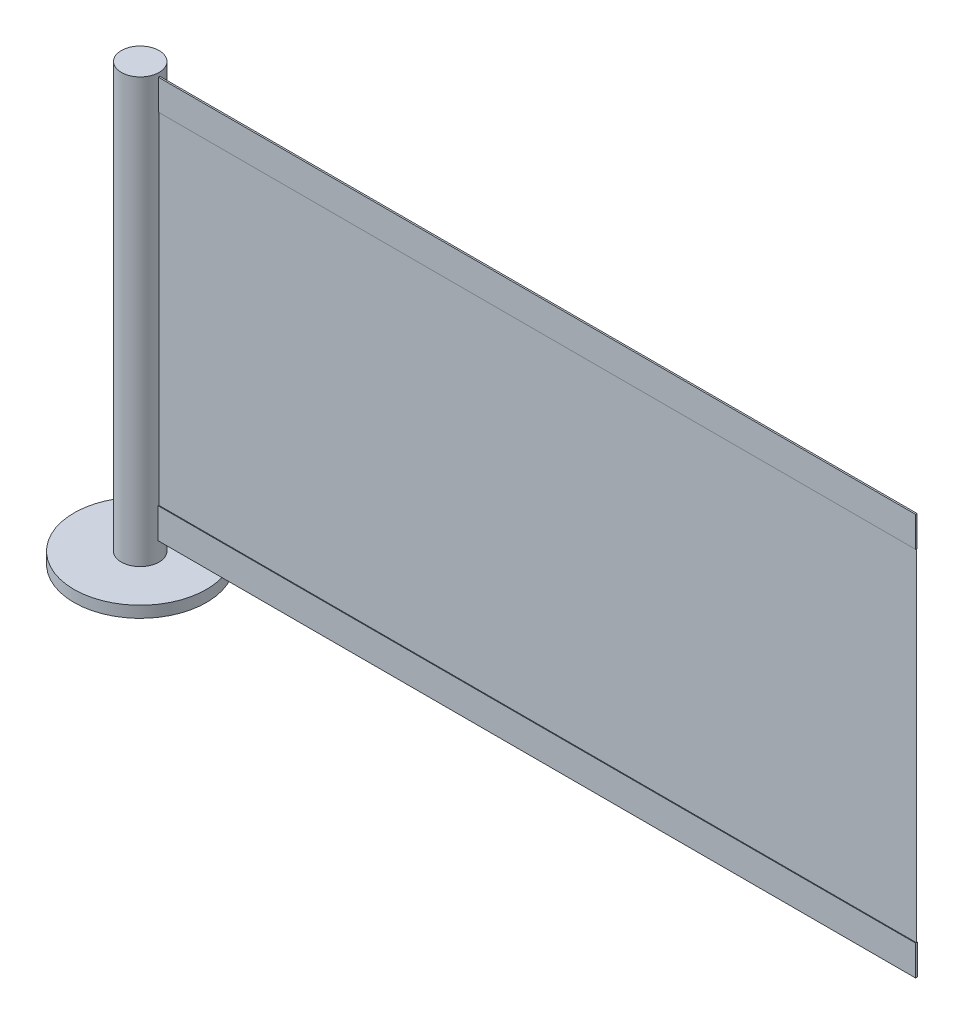
ISO-10303-21;
HEADER;
FILE_DESCRIPTION(('STEP AP214'),'2;1');
FILE_NAME('part.step','',(''),(''),'','','');
FILE_SCHEMA(('AUTOMOTIVE_DESIGN { 1 0 10303 214 1 1 1 1 }'));
ENDSEC;
DATA;
#1=APPLICATION_CONTEXT('core data for automotive mechanical design processes');
#2=APPLICATION_PROTOCOL_DEFINITION('international standard','automotive_design',2000,#1);
#3=PRODUCT_CONTEXT('',#1,'mechanical');
#4=PRODUCT('Part','Part','',(#3));
#5=PRODUCT_RELATED_PRODUCT_CATEGORY('part','',(#4));
#6=PRODUCT_DEFINITION_FORMATION('','',#4);
#7=PRODUCT_DEFINITION_CONTEXT('part definition',#1,'design');
#8=PRODUCT_DEFINITION('design','',#6,#7);
#9=PRODUCT_DEFINITION_SHAPE('','',#8);
#10=(LENGTH_UNIT() NAMED_UNIT(*) SI_UNIT(.MILLI.,.METRE.));
#11=(NAMED_UNIT(*) PLANE_ANGLE_UNIT() SI_UNIT($,.RADIAN.));
#12=(NAMED_UNIT(*) SI_UNIT($,.STERADIAN.) SOLID_ANGLE_UNIT());
#13=UNCERTAINTY_MEASURE_WITH_UNIT(LENGTH_MEASURE(1.E-05),#10,'distance_accuracy_value','');
#14=(GEOMETRIC_REPRESENTATION_CONTEXT(3) GLOBAL_UNCERTAINTY_ASSIGNED_CONTEXT((#13)) GLOBAL_UNIT_ASSIGNED_CONTEXT((#10,
#11,#12)) REPRESENTATION_CONTEXT('',''));
#15=CARTESIAN_POINT('',(0.,0.,0.));
#16=DIRECTION('',(0.,0.,1.));
#17=DIRECTION('',(1.,0.,0.));
#18=AXIS2_PLACEMENT_3D('',#15,#16,#17);
#19=CARTESIAN_POINT('',(0.,30.,0.));
#20=DIRECTION('',(0.,-1.,0.));
#21=DIRECTION('',(0.,0.,-1.));
#22=AXIS2_PLACEMENT_3D('',#19,#20,#21);
#23=CYLINDRICAL_SURFACE('',#22,175.);
#24=CARTESIAN_POINT('',(0.,30.,0.));
#25=DIRECTION('',(0.,1.,0.));
#26=DIRECTION('',(0.,0.,1.));
#27=AXIS2_PLACEMENT_3D('',#24,#25,#26);
#28=CIRCLE('',#27,175.);
#29=CARTESIAN_POINT('',(0.,30.,175.));
#30=VERTEX_POINT('',#29);
#31=EDGE_CURVE('E256',#30,#30,#28,.T.);
#32=ORIENTED_EDGE('',*,*,#31,.F.);
#33=EDGE_LOOP('',(#32));
#34=FACE_BOUND('',#33,.T.);
#35=CARTESIAN_POINT('',(0.,0.,0.));
#36=DIRECTION('',(0.,1.,0.));
#37=DIRECTION('',(0.,0.,1.));
#38=AXIS2_PLACEMENT_3D('',#35,#36,#37);
#39=CIRCLE('',#38,175.);
#40=CARTESIAN_POINT('',(0.,0.,175.));
#41=VERTEX_POINT('',#40);
#42=EDGE_CURVE('E251',#41,#41,#39,.T.);
#43=ORIENTED_EDGE('',*,*,#42,.T.);
#44=EDGE_LOOP('',(#43));
#45=FACE_BOUND('',#44,.T.);
#46=ADVANCED_FACE('F41',(#34,#45),#23,.T.);
#47=CARTESIAN_POINT('',(0.,30.,0.));
#48=DIRECTION('',(0.,1.,0.));
#49=DIRECTION('',(0.,0.,1.));
#50=AXIS2_PLACEMENT_3D('',#47,#48,#49);
#51=PLANE('',#50);
#52=CARTESIAN_POINT('',(0.,30.,0.));
#53=DIRECTION('',(0.,1.,0.));
#54=DIRECTION('',(0.,0.,1.));
#55=AXIS2_PLACEMENT_3D('',#52,#53,#54);
#56=CIRCLE('',#55,50.);
#57=CARTESIAN_POINT('',(0.,30.,50.));
#58=VERTEX_POINT('',#57);
#59=EDGE_CURVE('E252',#58,#58,#56,.T.);
#60=ORIENTED_EDGE('',*,*,#59,.F.);
#61=EDGE_LOOP('',(#60));
#62=FACE_BOUND('',#61,.T.);
#63=ORIENTED_EDGE('',*,*,#31,.T.);
#64=EDGE_LOOP('',(#63));
#65=FACE_BOUND('',#64,.T.);
#66=ADVANCED_FACE('F323',(#62,#65),#51,.T.);
#67=CARTESIAN_POINT('',(0.,0.,0.));
#68=DIRECTION('',(0.,1.,0.));
#69=DIRECTION('',(0.,0.,1.));
#70=AXIS2_PLACEMENT_3D('',#67,#68,#69);
#71=PLANE('',#70);
#72=ORIENTED_EDGE('',*,*,#42,.F.);
#73=EDGE_LOOP('',(#72));
#74=FACE_BOUND('',#73,.T.);
#75=ADVANCED_FACE('F328',(#74),#71,.F.);
#76=CARTESIAN_POINT('',(0.,1140.,0.));
#77=DIRECTION('',(0.,-1.,0.));
#78=DIRECTION('',(0.,0.,-1.));
#79=AXIS2_PLACEMENT_3D('',#76,#77,#78);
#80=CYLINDRICAL_SURFACE('',#79,50.);
#81=DIRECTION('',(0.,-1.,0.));
#82=VECTOR('',#81,1.);
#83=CARTESIAN_POINT('',(49.9389936535584,1140.,2.46919275672328));
#84=LINE('',#83,#82);
#85=CARTESIAN_POINT('',(49.9389936535584,80.0000000000003,2.46919275672322));
#86=VERTEX_POINT('',#85);
#87=CARTESIAN_POINT('',(49.9389936535584,160.,2.46919275672328));
#88=VERTEX_POINT('',#87);
#89=EDGE_CURVE('E11',#86,#88,#84,.F.);
#90=ORIENTED_EDGE('',*,*,#89,.T.);
#91=CARTESIAN_POINT('',(0.,160.,0.));
#92=DIRECTION('',(0.,1.,0.));
#93=DIRECTION('',(-1.,0.,0.));
#94=AXIS2_PLACEMENT_3D('',#91,#92,#93);
#95=CIRCLE('',#94,50.);
#96=CARTESIAN_POINT('',(49.9974999374969,160.,0.499999999999982));
#97=VERTEX_POINT('',#96);
#98=EDGE_CURVE('E197',#88,#97,#95,.T.);
#99=ORIENTED_EDGE('',*,*,#98,.T.);
#100=DIRECTION('',(0.,-1.,0.));
#101=VECTOR('',#100,1.);
#102=CARTESIAN_POINT('',(49.9974999374969,1140.,0.499999999999982));
#103=LINE('',#102,#101);
#104=CARTESIAN_POINT('',(49.9974999374969,1060.,0.499999999999982));
#105=VERTEX_POINT('',#104);
#106=EDGE_CURVE('E248',#97,#105,#103,.F.);
#107=ORIENTED_EDGE('',*,*,#106,.T.);
#108=CARTESIAN_POINT('',(0.,1060.,0.));
#109=DIRECTION('',(0.,-1.,0.));
#110=DIRECTION('',(0.,0.,-1.));
#111=AXIS2_PLACEMENT_3D('',#108,#109,#110);
#112=CIRCLE('',#111,50.);
#113=CARTESIAN_POINT('',(49.9599839871872,1060.,2.));
#114=VERTEX_POINT('',#113);
#115=EDGE_CURVE('E133',#105,#114,#112,.T.);
#116=ORIENTED_EDGE('',*,*,#115,.T.);
#117=DIRECTION('',(0.,-1.,0.));
#118=VECTOR('',#117,1.);
#119=CARTESIAN_POINT('',(49.9599839871872,1140.,2.));
#120=LINE('',#119,#118);
#121=CARTESIAN_POINT('',(49.9599839871872,1140.,2.));
#122=VERTEX_POINT('',#121);
#123=EDGE_CURVE('E125',#114,#122,#120,.F.);
#124=ORIENTED_EDGE('',*,*,#123,.T.);
#125=CARTESIAN_POINT('',(0.,1140.,0.));
#126=DIRECTION('',(0.,1.,0.));
#127=DIRECTION('',(0.,0.,1.));
#128=AXIS2_PLACEMENT_3D('',#125,#126,#127);
#129=CIRCLE('',#128,50.);
#130=CARTESIAN_POINT('',(49.9599839871872,1140.,-2.00000000000002));
#131=VERTEX_POINT('',#130);
#132=EDGE_CURVE('E131',#122,#131,#129,.T.);
#133=ORIENTED_EDGE('',*,*,#132,.T.);
#134=DIRECTION('',(0.,-1.,0.));
#135=VECTOR('',#134,1.);
#136=CARTESIAN_POINT('',(49.9599839871872,1140.,-2.00000000000002));
#137=LINE('',#136,#135);
#138=CARTESIAN_POINT('',(49.9599839871872,1060.,-2.00000000000002));
#139=VERTEX_POINT('',#138);
#140=EDGE_CURVE('E138',#131,#139,#137,.T.);
#141=ORIENTED_EDGE('',*,*,#140,.T.);
#142=CARTESIAN_POINT('',(49.9974999374969,1060.,-0.5));
#143=VERTEX_POINT('',#142);
#144=EDGE_CURVE('E223',#139,#143,#112,.T.);
#145=ORIENTED_EDGE('',*,*,#144,.T.);
#146=DIRECTION('',(0.,-1.,0.));
#147=VECTOR('',#146,1.);
#148=CARTESIAN_POINT('',(49.9974999374969,1140.,-0.5));
#149=LINE('',#148,#147);
#150=CARTESIAN_POINT('',(49.9974999374969,160.,-0.5));
#151=VERTEX_POINT('',#150);
#152=EDGE_CURVE('E242',#143,#151,#149,.T.);
#153=ORIENTED_EDGE('',*,*,#152,.T.);
#154=CARTESIAN_POINT('',(49.9389936535584,160.,-2.46919275672316));
#155=VERTEX_POINT('',#154);
#156=EDGE_CURVE('E193',#151,#155,#95,.T.);
#157=ORIENTED_EDGE('',*,*,#156,.T.);
#158=DIRECTION('',(0.,-1.,0.));
#159=VECTOR('',#158,1.);
#160=CARTESIAN_POINT('',(49.9389936535584,1140.,-2.46919275672316));
#161=LINE('',#160,#159);
#162=CARTESIAN_POINT('',(49.9389936535584,80.0000000000003,-2.46919275672323));
#163=VERTEX_POINT('',#162);
#164=EDGE_CURVE('E49',#155,#163,#161,.T.);
#165=ORIENTED_EDGE('',*,*,#164,.T.);
#166=CARTESIAN_POINT('',(0.,80.0000000000001,0.));
#167=DIRECTION('',(0.,-1.,0.));
#168=DIRECTION('',(0.,0.,-1.));
#169=AXIS2_PLACEMENT_3D('',#166,#167,#168);
#170=CIRCLE('',#169,50.);
#171=EDGE_CURVE('E59',#163,#86,#170,.T.);
#172=ORIENTED_EDGE('',*,*,#171,.T.);
#173=EDGE_LOOP('',(#90,#99,#107,#116,#124,#133,#141,#145,#153,#157,#165,#172));
#174=FACE_BOUND('',#173,.T.);
#175=ORIENTED_EDGE('',*,*,#59,.T.);
#176=EDGE_LOOP('',(#175));
#177=FACE_BOUND('',#176,.T.);
#178=CARTESIAN_POINT('',(0.,1150.,0.));
#179=DIRECTION('',(0.,1.,0.));
#180=DIRECTION('',(0.,0.,1.));
#181=AXIS2_PLACEMENT_3D('',#178,#179,#180);
#182=CIRCLE('',#181,50.);
#183=CARTESIAN_POINT('',(0.,1150.,50.));
#184=VERTEX_POINT('',#183);
#185=EDGE_CURVE('E155',#184,#184,#182,.T.);
#186=ORIENTED_EDGE('',*,*,#185,.F.);
#187=EDGE_LOOP('',(#186));
#188=FACE_BOUND('',#187,.T.);
#189=ADVANCED_FACE('F127',(#174,#177,#188),#80,.T.);
#190=CARTESIAN_POINT('',(0.,1140.,0.));
#191=DIRECTION('',(0.,1.,0.));
#192=DIRECTION('',(0.,0.,1.));
#193=AXIS2_PLACEMENT_3D('',#190,#191,#192);
#194=PLANE('',#193);
#195=ORIENTED_EDGE('',*,*,#132,.F.);
#196=DIRECTION('',(1.,0.,0.));
#197=VECTOR('',#196,1.);
#198=CARTESIAN_POINT('',(0.,1140.,2.));
#199=LINE('',#198,#197);
#200=CARTESIAN_POINT('',(2050.,1140.,2.));
#201=VERTEX_POINT('',#200);
#202=EDGE_CURVE('E142',#122,#201,#199,.T.);
#203=ORIENTED_EDGE('',*,*,#202,.T.);
#204=DIRECTION('',(0.,0.,-1.));
#205=VECTOR('',#204,1.);
#206=CARTESIAN_POINT('',(2050.,1140.,0.499999999999247));
#207=LINE('',#206,#205);
#208=CARTESIAN_POINT('',(2050.,1140.,-2.00000000000075));
#209=VERTEX_POINT('',#208);
#210=EDGE_CURVE('E137',#201,#209,#207,.T.);
#211=ORIENTED_EDGE('',*,*,#210,.T.);
#212=DIRECTION('',(-1.,0.,0.));
#213=VECTOR('',#212,1.);
#214=CARTESIAN_POINT('',(0.,1140.,-2.));
#215=LINE('',#214,#213);
#216=EDGE_CURVE('E149',#209,#131,#215,.T.);
#217=ORIENTED_EDGE('',*,*,#216,.T.);
#218=EDGE_LOOP('',(#195,#203,#211,#217));
#219=FACE_BOUND('',#218,.T.);
#220=ADVANCED_FACE('F152',(#219),#194,.T.);
#221=CARTESIAN_POINT('',(0.,80.0000000000001,0.5));
#222=DIRECTION('',(0.,0.,1.));
#223=DIRECTION('',(1.,0.,0.));
#224=AXIS2_PLACEMENT_3D('',#221,#222,#223);
#225=PLANE('',#224);
#226=DIRECTION('',(-1.,0.,0.));
#227=VECTOR('',#226,1.);
#228=CARTESIAN_POINT('',(0.,160.,0.5));
#229=LINE('',#228,#227);
#230=CARTESIAN_POINT('',(2050.,160.,0.499999999999247));
#231=VERTEX_POINT('',#230);
#232=EDGE_CURVE('E196',#231,#97,#229,.T.);
#233=ORIENTED_EDGE('',*,*,#232,.F.);
#234=DIRECTION('',(0.,1.,0.));
#235=VECTOR('',#234,1.);
#236=CARTESIAN_POINT('',(2050.,80.0000000000001,0.499999999999247));
#237=LINE('',#236,#235);
#238=CARTESIAN_POINT('',(2050.,1060.,0.499999999999247));
#239=VERTEX_POINT('',#238);
#240=EDGE_CURVE('E239',#231,#239,#237,.T.);
#241=ORIENTED_EDGE('',*,*,#240,.T.);
#242=DIRECTION('',(1.,0.,0.));
#243=VECTOR('',#242,1.);
#244=CARTESIAN_POINT('',(0.,1060.,0.5));
#245=LINE('',#244,#243);
#246=EDGE_CURVE('E227',#105,#239,#245,.T.);
#247=ORIENTED_EDGE('',*,*,#246,.F.);
#248=ORIENTED_EDGE('',*,*,#106,.F.);
#249=EDGE_LOOP('',(#233,#241,#247,#248));
#250=FACE_BOUND('',#249,.T.);
#251=ADVANCED_FACE('F291',(#250),#225,.T.);
#252=CARTESIAN_POINT('',(0.,80.0000000000001,-0.5));
#253=DIRECTION('',(0.,0.,-1.));
#254=DIRECTION('',(-1.,0.,0.));
#255=AXIS2_PLACEMENT_3D('',#252,#253,#254);
#256=PLANE('',#255);
#257=DIRECTION('',(1.,0.,0.));
#258=VECTOR('',#257,1.);
#259=CARTESIAN_POINT('',(0.,160.,-0.5));
#260=LINE('',#259,#258);
#261=CARTESIAN_POINT('',(2050.,160.,-0.5));
#262=VERTEX_POINT('',#261);
#263=EDGE_CURVE('E186',#151,#262,#260,.T.);
#264=ORIENTED_EDGE('',*,*,#263,.F.);
#265=ORIENTED_EDGE('',*,*,#152,.F.);
#266=DIRECTION('',(-1.,0.,0.));
#267=VECTOR('',#266,1.);
#268=CARTESIAN_POINT('',(0.,1060.,-0.5));
#269=LINE('',#268,#267);
#270=CARTESIAN_POINT('',(2050.,1060.,-0.5));
#271=VERTEX_POINT('',#270);
#272=EDGE_CURVE('E217',#271,#143,#269,.T.);
#273=ORIENTED_EDGE('',*,*,#272,.F.);
#274=DIRECTION('',(0.,1.,0.));
#275=VECTOR('',#274,1.);
#276=CARTESIAN_POINT('',(2050.,80.0000000000001,-0.5));
#277=LINE('',#276,#275);
#278=EDGE_CURVE('E236',#262,#271,#277,.T.);
#279=ORIENTED_EDGE('',*,*,#278,.F.);
#280=EDGE_LOOP('',(#264,#265,#273,#279));
#281=FACE_BOUND('',#280,.T.);
#282=ADVANCED_FACE('F306',(#281),#256,.T.);
#283=CARTESIAN_POINT('',(2050.,80.0000000000001,0.499999999999247));
#284=DIRECTION('',(1.,0.,0.));
#285=DIRECTION('',(0.,0.,-1.));
#286=AXIS2_PLACEMENT_3D('',#283,#284,#285);
#287=PLANE('',#286);
#288=ORIENTED_EDGE('',*,*,#240,.F.);
#289=DIRECTION('',(0.,0.,1.));
#290=VECTOR('',#289,1.);
#291=CARTESIAN_POINT('',(2050.,160.,2.46919275672322));
#292=LINE('',#291,#290);
#293=CARTESIAN_POINT('',(2050.,160.,2.46919275672322));
#294=VERTEX_POINT('',#293);
#295=EDGE_CURVE('E165',#231,#294,#292,.T.);
#296=ORIENTED_EDGE('',*,*,#295,.T.);
#297=DIRECTION('',(0.,-1.,0.));
#298=VECTOR('',#297,1.);
#299=CARTESIAN_POINT('',(2050.,160.,2.46919275672322));
#300=LINE('',#299,#298);
#301=CARTESIAN_POINT('',(2050.,80.0000000000001,2.46919275672322));
#302=VERTEX_POINT('',#301);
#303=EDGE_CURVE('E182',#294,#302,#300,.T.);
#304=ORIENTED_EDGE('',*,*,#303,.T.);
#305=DIRECTION('',(0.,0.,-1.));
#306=VECTOR('',#305,1.);
#307=CARTESIAN_POINT('',(2050.,80.0000000000001,0.499999999999247));
#308=LINE('',#307,#306);
#309=CARTESIAN_POINT('',(2050.,80.0000000000001,-2.46919275672397));
#310=VERTEX_POINT('',#309);
#311=EDGE_CURVE('E233',#302,#310,#308,.T.);
#312=ORIENTED_EDGE('',*,*,#311,.T.);
#313=DIRECTION('',(0.,-1.,0.));
#314=VECTOR('',#313,1.);
#315=CARTESIAN_POINT('',(2050.,160.,-2.46919275672396));
#316=LINE('',#315,#314);
#317=CARTESIAN_POINT('',(2050.,160.,-2.46919275672396));
#318=VERTEX_POINT('',#317);
#319=EDGE_CURVE('E175',#318,#310,#316,.T.);
#320=ORIENTED_EDGE('',*,*,#319,.F.);
#321=EDGE_CURVE('E167',#318,#262,#292,.T.);
#322=ORIENTED_EDGE('',*,*,#321,.T.);
#323=ORIENTED_EDGE('',*,*,#278,.T.);
#324=DIRECTION('',(0.,0.,-1.));
#325=VECTOR('',#324,1.);
#326=CARTESIAN_POINT('',(2050.,1060.,2.));
#327=LINE('',#326,#325);
#328=CARTESIAN_POINT('',(2050.,1060.,-2.00000000000075));
#329=VERTEX_POINT('',#328);
#330=EDGE_CURVE('E148',#271,#329,#327,.T.);
#331=ORIENTED_EDGE('',*,*,#330,.T.);
#332=DIRECTION('',(0.,1.,0.));
#333=VECTOR('',#332,1.);
#334=CARTESIAN_POINT('',(2050.,1060.,-2.00000000000075));
#335=LINE('',#334,#333);
#336=EDGE_CURVE('E212',#329,#209,#335,.T.);
#337=ORIENTED_EDGE('',*,*,#336,.T.);
#338=ORIENTED_EDGE('',*,*,#210,.F.);
#339=DIRECTION('',(0.,1.,0.));
#340=VECTOR('',#339,1.);
#341=CARTESIAN_POINT('',(2050.,1060.,2.));
#342=LINE('',#341,#340);
#343=CARTESIAN_POINT('',(2050.,1060.,2.));
#344=VERTEX_POINT('',#343);
#345=EDGE_CURVE('E145',#344,#201,#342,.T.);
#346=ORIENTED_EDGE('',*,*,#345,.F.);
#347=EDGE_CURVE('E201',#344,#239,#327,.T.);
#348=ORIENTED_EDGE('',*,*,#347,.T.);
#349=EDGE_LOOP('',(#288,#296,#304,#312,#320,#322,#323,#331,#337,#338,#346,#348));
#350=FACE_BOUND('',#349,.T.);
#351=ADVANCED_FACE('F287',(#350),#287,.T.);
#352=CARTESIAN_POINT('',(0.,80.0000000000001,0.));
#353=DIRECTION('',(0.,-1.,0.));
#354=DIRECTION('',(0.,0.,-1.));
#355=AXIS2_PLACEMENT_3D('',#352,#353,#354);
#356=PLANE('',#355);
#357=ORIENTED_EDGE('',*,*,#171,.F.);
#358=DIRECTION('',(1.,0.,0.));
#359=VECTOR('',#358,1.);
#360=CARTESIAN_POINT('',(2050.,80.0000000000001,-2.46919275672397));
#361=LINE('',#360,#359);
#362=EDGE_CURVE('E159',#163,#310,#361,.T.);
#363=ORIENTED_EDGE('',*,*,#362,.T.);
#364=ORIENTED_EDGE('',*,*,#311,.F.);
#365=DIRECTION('',(-1.,0.,0.));
#366=VECTOR('',#365,1.);
#367=CARTESIAN_POINT('',(2050.,80.0000000000001,2.46919275672322));
#368=LINE('',#367,#366);
#369=EDGE_CURVE('E166',#302,#86,#368,.T.);
#370=ORIENTED_EDGE('',*,*,#369,.T.);
#371=EDGE_LOOP('',(#357,#363,#364,#370));
#372=FACE_BOUND('',#371,.T.);
#373=ADVANCED_FACE('F273',(#372),#356,.T.);
#374=CARTESIAN_POINT('',(0.,1060.,0.));
#375=DIRECTION('',(0.,-1.,0.));
#376=DIRECTION('',(0.,0.,-1.));
#377=AXIS2_PLACEMENT_3D('',#374,#375,#376);
#378=PLANE('',#377);
#379=ORIENTED_EDGE('',*,*,#144,.F.);
#380=DIRECTION('',(-1.,0.,0.));
#381=VECTOR('',#380,1.);
#382=CARTESIAN_POINT('',(0.,1060.,-2.));
#383=LINE('',#382,#381);
#384=EDGE_CURVE('E205',#329,#139,#383,.T.);
#385=ORIENTED_EDGE('',*,*,#384,.F.);
#386=ORIENTED_EDGE('',*,*,#330,.F.);
#387=ORIENTED_EDGE('',*,*,#272,.T.);
#388=EDGE_LOOP('',(#379,#385,#386,#387));
#389=FACE_BOUND('',#388,.T.);
#390=ADVANCED_FACE('F303',(#389),#378,.T.);
#391=CARTESIAN_POINT('',(0.,1060.,-2.));
#392=DIRECTION('',(0.,0.,-1.));
#393=DIRECTION('',(-1.,0.,0.));
#394=AXIS2_PLACEMENT_3D('',#391,#392,#393);
#395=PLANE('',#394);
#396=ORIENTED_EDGE('',*,*,#140,.F.);
#397=ORIENTED_EDGE('',*,*,#216,.F.);
#398=ORIENTED_EDGE('',*,*,#336,.F.);
#399=ORIENTED_EDGE('',*,*,#384,.T.);
#400=EDGE_LOOP('',(#396,#397,#398,#399));
#401=FACE_BOUND('',#400,.T.);
#402=ADVANCED_FACE('F302',(#401),#395,.T.);
#403=CARTESIAN_POINT('',(0.,1060.,2.));
#404=DIRECTION('',(0.,0.,1.));
#405=DIRECTION('',(1.,0.,0.));
#406=AXIS2_PLACEMENT_3D('',#403,#404,#405);
#407=PLANE('',#406);
#408=ORIENTED_EDGE('',*,*,#123,.F.);
#409=DIRECTION('',(1.,0.,0.));
#410=VECTOR('',#409,1.);
#411=CARTESIAN_POINT('',(0.,1060.,2.));
#412=LINE('',#411,#410);
#413=EDGE_CURVE('E209',#114,#344,#412,.T.);
#414=ORIENTED_EDGE('',*,*,#413,.T.);
#415=ORIENTED_EDGE('',*,*,#345,.T.);
#416=ORIENTED_EDGE('',*,*,#202,.F.);
#417=EDGE_LOOP('',(#408,#414,#415,#416));
#418=FACE_BOUND('',#417,.T.);
#419=ADVANCED_FACE('F143',(#418),#407,.T.);
#420=ORIENTED_EDGE('',*,*,#115,.F.);
#421=ORIENTED_EDGE('',*,*,#246,.T.);
#422=ORIENTED_EDGE('',*,*,#347,.F.);
#423=ORIENTED_EDGE('',*,*,#413,.F.);
#424=EDGE_LOOP('',(#420,#421,#422,#423));
#425=FACE_BOUND('',#424,.T.);
#426=ADVANCED_FACE('F293',(#425),#378,.T.);
#427=CARTESIAN_POINT('',(0.,160.,0.));
#428=DIRECTION('',(0.,1.,0.));
#429=DIRECTION('',(-1.,0.,0.));
#430=AXIS2_PLACEMENT_3D('',#427,#428,#429);
#431=PLANE('',#430);
#432=ORIENTED_EDGE('',*,*,#156,.F.);
#433=ORIENTED_EDGE('',*,*,#263,.T.);
#434=ORIENTED_EDGE('',*,*,#321,.F.);
#435=DIRECTION('',(1.,0.,0.));
#436=VECTOR('',#435,1.);
#437=CARTESIAN_POINT('',(2050.,160.,-2.46919275672396));
#438=LINE('',#437,#436);
#439=EDGE_CURVE('E162',#155,#318,#438,.T.);
#440=ORIENTED_EDGE('',*,*,#439,.F.);
#441=EDGE_LOOP('',(#432,#433,#434,#440));
#442=FACE_BOUND('',#441,.T.);
#443=ADVANCED_FACE('F309',(#442),#431,.T.);
#444=CARTESIAN_POINT('',(2050.,160.,-2.46919275672396));
#445=DIRECTION('',(0.,0.,-1.));
#446=DIRECTION('',(-1.,0.,0.));
#447=AXIS2_PLACEMENT_3D('',#444,#445,#446);
#448=PLANE('',#447);
#449=ORIENTED_EDGE('',*,*,#164,.F.);
#450=ORIENTED_EDGE('',*,*,#439,.T.);
#451=ORIENTED_EDGE('',*,*,#319,.T.);
#452=ORIENTED_EDGE('',*,*,#362,.F.);
#453=EDGE_LOOP('',(#449,#450,#451,#452));
#454=FACE_BOUND('',#453,.T.);
#455=ADVANCED_FACE('F270',(#454),#448,.T.);
#456=CARTESIAN_POINT('',(2050.,160.,2.46919275672322));
#457=DIRECTION('',(0.,0.,1.));
#458=DIRECTION('',(0.,-1.,0.));
#459=AXIS2_PLACEMENT_3D('',#456,#457,#458);
#460=PLANE('',#459);
#461=ORIENTED_EDGE('',*,*,#89,.F.);
#462=ORIENTED_EDGE('',*,*,#369,.F.);
#463=ORIENTED_EDGE('',*,*,#303,.F.);
#464=DIRECTION('',(-1.,0.,0.));
#465=VECTOR('',#464,1.);
#466=CARTESIAN_POINT('',(2050.,160.,2.46919275672322));
#467=LINE('',#466,#465);
#468=EDGE_CURVE('E171',#294,#88,#467,.T.);
#469=ORIENTED_EDGE('',*,*,#468,.T.);
#470=EDGE_LOOP('',(#461,#462,#463,#469));
#471=FACE_BOUND('',#470,.T.);
#472=ADVANCED_FACE('F277',(#471),#460,.T.);
#473=ORIENTED_EDGE('',*,*,#98,.F.);
#474=ORIENTED_EDGE('',*,*,#468,.F.);
#475=ORIENTED_EDGE('',*,*,#295,.F.);
#476=ORIENTED_EDGE('',*,*,#232,.T.);
#477=EDGE_LOOP('',(#473,#474,#475,#476));
#478=FACE_BOUND('',#477,.T.);
#479=ADVANCED_FACE('F281',(#478),#431,.T.);
#480=CARTESIAN_POINT('',(0.,1150.,0.));
#481=DIRECTION('',(0.,1.,0.));
#482=DIRECTION('',(0.,0.,1.));
#483=AXIS2_PLACEMENT_3D('',#480,#481,#482);
#484=PLANE('',#483);
#485=ORIENTED_EDGE('',*,*,#185,.T.);
#486=EDGE_LOOP('',(#485));
#487=FACE_BOUND('',#486,.T.);
#488=ADVANCED_FACE('F321',(#487),#484,.T.);
#489=CLOSED_SHELL('',(#46,#66,#75,#189,#220,#251,#282,#351,#373,#390,#402,#419,#426,#443,#455,
#472,#479,#488));
#490=MANIFOLD_SOLID_BREP('B2',#489);
#491=ADVANCED_BREP_SHAPE_REPRESENTATION('',(#18,#490),#14);
#492=SHAPE_DEFINITION_REPRESENTATION(#9,#491);
ENDSEC;
END-ISO-10303-21;
